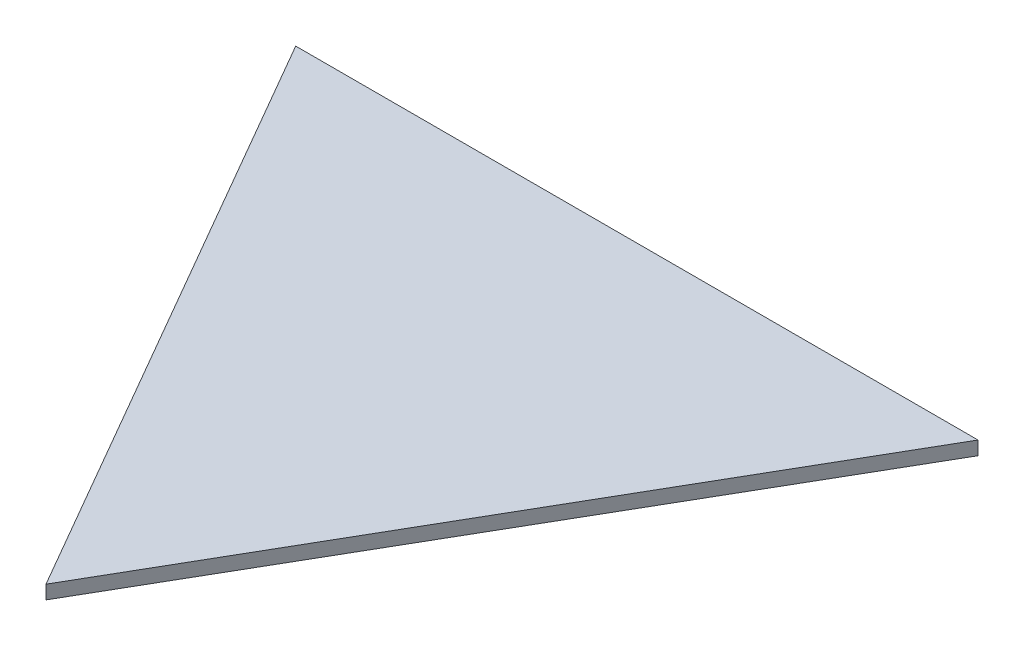
ISO-10303-21;
HEADER;
FILE_DESCRIPTION(('STEP AP214'),'2;1');
FILE_NAME('part.step','',(''),(''),'','','');
FILE_SCHEMA(('AUTOMOTIVE_DESIGN { 1 0 10303 214 1 1 1 1 }'));
ENDSEC;
DATA;
#1=APPLICATION_CONTEXT('core data for automotive mechanical design processes');
#2=APPLICATION_PROTOCOL_DEFINITION('international standard','automotive_design',2000,#1);
#3=PRODUCT_CONTEXT('',#1,'mechanical');
#4=PRODUCT('Part','Part','',(#3));
#5=PRODUCT_RELATED_PRODUCT_CATEGORY('part','',(#4));
#6=PRODUCT_DEFINITION_FORMATION('','',#4);
#7=PRODUCT_DEFINITION_CONTEXT('part definition',#1,'design');
#8=PRODUCT_DEFINITION('design','',#6,#7);
#9=PRODUCT_DEFINITION_SHAPE('','',#8);
#10=(LENGTH_UNIT() NAMED_UNIT(*) SI_UNIT(.MILLI.,.METRE.));
#11=(NAMED_UNIT(*) PLANE_ANGLE_UNIT() SI_UNIT($,.RADIAN.));
#12=(NAMED_UNIT(*) SI_UNIT($,.STERADIAN.) SOLID_ANGLE_UNIT());
#13=UNCERTAINTY_MEASURE_WITH_UNIT(LENGTH_MEASURE(1.E-05),#10,'distance_accuracy_value','');
#14=(GEOMETRIC_REPRESENTATION_CONTEXT(3) GLOBAL_UNCERTAINTY_ASSIGNED_CONTEXT((#13)) GLOBAL_UNIT_ASSIGNED_CONTEXT((#10,
#11,#12)) REPRESENTATION_CONTEXT('',''));
#15=CARTESIAN_POINT('',(0.,0.,0.));
#16=DIRECTION('',(0.,0.,1.));
#17=DIRECTION('',(1.,0.,0.));
#18=AXIS2_PLACEMENT_3D('',#15,#16,#17);
#19=CARTESIAN_POINT('',(-222.407496998604,10.,-96.5397848015825));
#20=DIRECTION('',(0.866019052628739,0.,-0.500011000363013));
#21=DIRECTION('',(-0.500011000363013,0.,-0.866019052628739));
#22=AXIS2_PLACEMENT_3D('',#19,#20,#21);
#23=PLANE('',#22);
#24=DIRECTION('',(0.500011000363013,0.,0.866019052628739));
#25=VECTOR('',#24,1.);
#26=CARTESIAN_POINT('',(-222.407496998604,0.,-96.5397848015825));
#27=LINE('',#26,#25);
#28=CARTESIAN_POINT('',(-250.,0.,-144.33));
#29=VERTEX_POINT('',#28);
#30=CARTESIAN_POINT('',(0.,0.,288.67));
#31=VERTEX_POINT('',#30);
#32=EDGE_CURVE('E66',#29,#31,#27,.T.);
#33=ORIENTED_EDGE('',*,*,#32,.T.);
#34=DIRECTION('',(0.,-1.,0.));
#35=VECTOR('',#34,1.);
#36=CARTESIAN_POINT('',(0.,10.,288.67));
#37=LINE('',#36,#35);
#38=CARTESIAN_POINT('',(0.,10.,288.67));
#39=VERTEX_POINT('',#38);
#40=EDGE_CURVE('E11',#39,#31,#37,.T.);
#41=ORIENTED_EDGE('',*,*,#40,.F.);
#42=DIRECTION('',(0.500011000363013,0.,0.866019052628739));
#43=VECTOR('',#42,1.);
#44=CARTESIAN_POINT('',(-222.407496998604,10.,-96.5397848015825));
#45=LINE('',#44,#43);
#46=CARTESIAN_POINT('',(-250.,10.,-144.33));
#47=VERTEX_POINT('',#46);
#48=EDGE_CURVE('E76',#47,#39,#45,.T.);
#49=ORIENTED_EDGE('',*,*,#48,.F.);
#50=DIRECTION('',(0.,-1.,0.));
#51=VECTOR('',#50,1.);
#52=CARTESIAN_POINT('',(-250.,10.,-144.33));
#53=LINE('',#52,#51);
#54=EDGE_CURVE('E40',#47,#29,#53,.T.);
#55=ORIENTED_EDGE('',*,*,#54,.T.);
#56=EDGE_LOOP('',(#33,#41,#49,#55));
#57=FACE_BOUND('',#56,.T.);
#58=ADVANCED_FACE('F26',(#57),#23,.F.);
#59=CARTESIAN_POINT('',(-34.9102471196095,10.,349.134548011164));
#60=DIRECTION('',(-0.866019052628739,0.,-0.500011000363013));
#61=DIRECTION('',(-0.500011000363013,0.,0.866019052628739));
#62=AXIS2_PLACEMENT_3D('',#59,#60,#61);
#63=PLANE('',#62);
#64=DIRECTION('',(0.500011000363013,0.,-0.866019052628739));
#65=VECTOR('',#64,1.);
#66=CARTESIAN_POINT('',(-34.9102471196095,0.,349.134548011164));
#67=LINE('',#66,#65);
#68=CARTESIAN_POINT('',(250.,0.,-144.33));
#69=VERTEX_POINT('',#68);
#70=EDGE_CURVE('E63',#31,#69,#67,.T.);
#71=ORIENTED_EDGE('',*,*,#70,.T.);
#72=DIRECTION('',(0.,-1.,0.));
#73=VECTOR('',#72,1.);
#74=CARTESIAN_POINT('',(250.,10.,-144.33));
#75=LINE('',#74,#73);
#76=CARTESIAN_POINT('',(250.,10.,-144.33));
#77=VERTEX_POINT('',#76);
#78=EDGE_CURVE('E33',#77,#69,#75,.T.);
#79=ORIENTED_EDGE('',*,*,#78,.F.);
#80=DIRECTION('',(0.500011000363013,0.,-0.866019052628739));
#81=VECTOR('',#80,1.);
#82=CARTESIAN_POINT('',(-34.9102471196095,10.,349.134548011164));
#83=LINE('',#82,#81);
#84=EDGE_CURVE('E48',#39,#77,#83,.T.);
#85=ORIENTED_EDGE('',*,*,#84,.F.);
#86=ORIENTED_EDGE('',*,*,#40,.T.);
#87=EDGE_LOOP('',(#71,#79,#85,#86));
#88=FACE_BOUND('',#87,.T.);
#89=ADVANCED_FACE('F71',(#88),#63,.F.);
#90=CARTESIAN_POINT('',(-514.612844274945,10.,-144.33));
#91=DIRECTION('',(0.,0.,-1.));
#92=DIRECTION('',(-1.,0.,0.));
#93=AXIS2_PLACEMENT_3D('',#90,#91,#92);
#94=PLANE('',#93);
#95=DIRECTION('',(1.,0.,0.));
#96=VECTOR('',#95,1.);
#97=CARTESIAN_POINT('',(-514.612844274945,0.,-144.33));
#98=LINE('',#97,#96);
#99=EDGE_CURVE('E67',#29,#69,#98,.T.);
#100=ORIENTED_EDGE('',*,*,#99,.F.);
#101=ORIENTED_EDGE('',*,*,#54,.F.);
#102=DIRECTION('',(1.,0.,0.));
#103=VECTOR('',#102,1.);
#104=CARTESIAN_POINT('',(-514.612844274945,10.,-144.33));
#105=LINE('',#104,#103);
#106=EDGE_CURVE('E79',#47,#77,#105,.T.);
#107=ORIENTED_EDGE('',*,*,#106,.T.);
#108=ORIENTED_EDGE('',*,*,#78,.T.);
#109=EDGE_LOOP('',(#100,#101,#107,#108));
#110=FACE_BOUND('',#109,.T.);
#111=ADVANCED_FACE('F81',(#110),#94,.T.);
#112=CARTESIAN_POINT('',(-514.612844274945,10.,72.17));
#113=DIRECTION('',(0.,1.,0.));
#114=DIRECTION('',(0.,0.,1.));
#115=AXIS2_PLACEMENT_3D('',#112,#113,#114);
#116=PLANE('',#115);
#117=ORIENTED_EDGE('',*,*,#48,.T.);
#118=ORIENTED_EDGE('',*,*,#84,.T.);
#119=ORIENTED_EDGE('',*,*,#106,.F.);
#120=EDGE_LOOP('',(#117,#118,#119));
#121=FACE_BOUND('',#120,.T.);
#122=ADVANCED_FACE('F82',(#121),#116,.T.);
#123=CARTESIAN_POINT('',(-514.612844274945,0.,72.17));
#124=DIRECTION('',(0.,1.,0.));
#125=DIRECTION('',(0.,0.,1.));
#126=AXIS2_PLACEMENT_3D('',#123,#124,#125);
#127=PLANE('',#126);
#128=ORIENTED_EDGE('',*,*,#32,.F.);
#129=ORIENTED_EDGE('',*,*,#99,.T.);
#130=ORIENTED_EDGE('',*,*,#70,.F.);
#131=EDGE_LOOP('',(#128,#129,#130));
#132=FACE_BOUND('',#131,.T.);
#133=ADVANCED_FACE('F64',(#132),#127,.F.);
#134=CLOSED_SHELL('',(#58,#89,#111,#122,#133));
#135=MANIFOLD_SOLID_BREP('B2',#134);
#136=ADVANCED_BREP_SHAPE_REPRESENTATION('',(#18,#135),#14);
#137=SHAPE_DEFINITION_REPRESENTATION(#9,#136);
ENDSEC;
END-ISO-10303-21;
